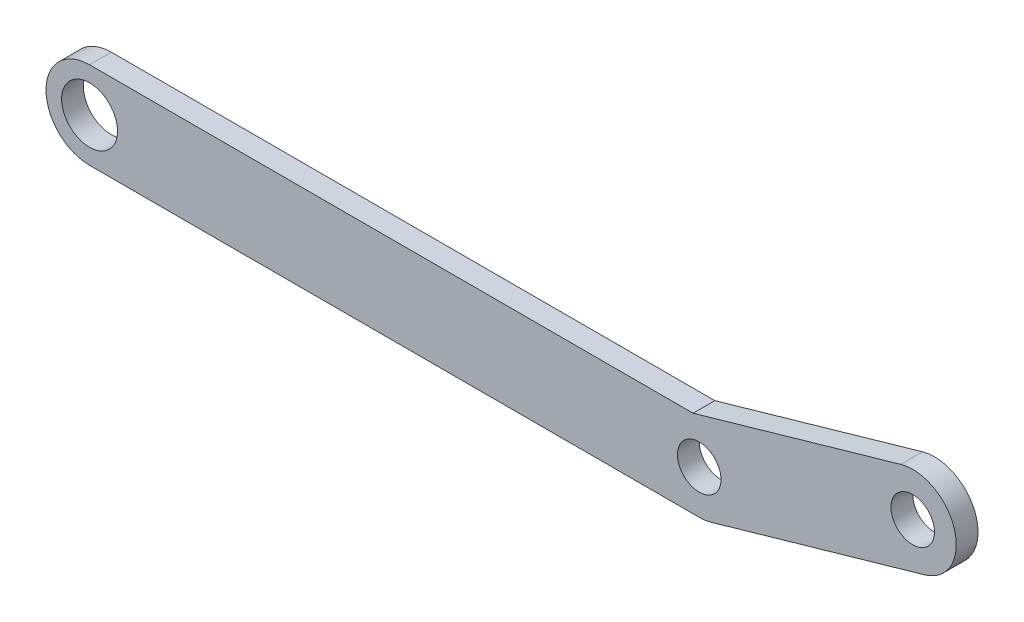
ISO-10303-21;
HEADER;
FILE_DESCRIPTION(('STEP AP214'),'2;1');
FILE_NAME('part.step','',(''),(''),'','','');
FILE_SCHEMA(('AUTOMOTIVE_DESIGN { 1 0 10303 214 1 1 1 1 }'));
ENDSEC;
DATA;
#1=APPLICATION_CONTEXT('core data for automotive mechanical design processes');
#2=APPLICATION_PROTOCOL_DEFINITION('international standard','automotive_design',2000,#1);
#3=PRODUCT_CONTEXT('',#1,'mechanical');
#4=PRODUCT('Part','Part','',(#3));
#5=PRODUCT_RELATED_PRODUCT_CATEGORY('part','',(#4));
#6=PRODUCT_DEFINITION_FORMATION('','',#4);
#7=PRODUCT_DEFINITION_CONTEXT('part definition',#1,'design');
#8=PRODUCT_DEFINITION('design','',#6,#7);
#9=PRODUCT_DEFINITION_SHAPE('','',#8);
#10=(LENGTH_UNIT() NAMED_UNIT(*) SI_UNIT(.MILLI.,.METRE.));
#11=(NAMED_UNIT(*) PLANE_ANGLE_UNIT() SI_UNIT($,.RADIAN.));
#12=(NAMED_UNIT(*) SI_UNIT($,.STERADIAN.) SOLID_ANGLE_UNIT());
#13=UNCERTAINTY_MEASURE_WITH_UNIT(LENGTH_MEASURE(1.E-05),#10,'distance_accuracy_value','');
#14=(GEOMETRIC_REPRESENTATION_CONTEXT(3) GLOBAL_UNCERTAINTY_ASSIGNED_CONTEXT((#13)) GLOBAL_UNIT_ASSIGNED_CONTEXT((#10,
#11,#12)) REPRESENTATION_CONTEXT('',''));
#15=CARTESIAN_POINT('',(0.,0.,0.));
#16=DIRECTION('',(0.,0.,1.));
#17=DIRECTION('',(1.,0.,0.));
#18=AXIS2_PLACEMENT_3D('',#15,#16,#17);
#19=CARTESIAN_POINT('',(-70.,0.,5.));
#20=DIRECTION('',(0.,0.,1.));
#21=DIRECTION('',(1.,0.,0.));
#22=AXIS2_PLACEMENT_3D('',#19,#20,#21);
#23=PLANE('',#22);
#24=CARTESIAN_POINT('',(70.,0.,5.));
#25=DIRECTION('',(0.,0.,1.));
#26=DIRECTION('',(1.,0.,0.));
#27=AXIS2_PLACEMENT_3D('',#24,#25,#26);
#28=CIRCLE('',#27,5.);
#29=CARTESIAN_POINT('',(75.,0.,5.));
#30=VERTEX_POINT('',#29);
#31=EDGE_CURVE('E196',#30,#30,#28,.T.);
#32=ORIENTED_EDGE('',*,*,#31,.F.);
#33=EDGE_LOOP('',(#32));
#34=FACE_BOUND('',#33,.T.);
#35=CARTESIAN_POINT('',(-70.,0.,5.));
#36=DIRECTION('',(0.,0.,1.));
#37=DIRECTION('',(1.,0.,0.));
#38=AXIS2_PLACEMENT_3D('',#35,#36,#37);
#39=CIRCLE('',#38,10.);
#40=CARTESIAN_POINT('',(-70.,10.,5.));
#41=VERTEX_POINT('',#40);
#42=CARTESIAN_POINT('',(-70.,-10.,5.));
#43=VERTEX_POINT('',#42);
#44=EDGE_CURVE('E161',#41,#43,#39,.T.);
#45=ORIENTED_EDGE('',*,*,#44,.T.);
#46=DIRECTION('',(1.,0.,0.));
#47=VECTOR('',#46,1.);
#48=CARTESIAN_POINT('',(-70.,-10.,5.));
#49=LINE('',#48,#47);
#50=CARTESIAN_POINT('',(69.9999999999996,-9.99999999999996,5.));
#51=VERTEX_POINT('',#50);
#52=EDGE_CURVE('E103',#43,#51,#49,.T.);
#53=ORIENTED_EDGE('',*,*,#52,.T.);
#54=CARTESIAN_POINT('',(69.9999999999999,2.8796409701215E-13,5.));
#55=DIRECTION('',(0.,0.,1.));
#56=DIRECTION('',(-1.,0.,0.));
#57=AXIS2_PLACEMENT_3D('',#54,#55,#56);
#58=CIRCLE('',#57,10.0000000000002);
#59=CARTESIAN_POINT('',(72.7563735581697,-9.61261695938318,5.));
#60=VERTEX_POINT('',#59);
#61=EDGE_CURVE('E179',#51,#60,#58,.T.);
#62=ORIENTED_EDGE('',*,*,#61,.T.);
#63=DIRECTION('',(0.961261695938319,0.275637355816998,0.));
#64=VECTOR('',#63,1.);
#65=CARTESIAN_POINT('',(72.7563735581697,-9.61261695938318,5.));
#66=LINE('',#65,#64);
#67=CARTESIAN_POINT('',(121.780720051024,4.44488818728381,5.));
#68=VERTEX_POINT('',#67);
#69=EDGE_CURVE('E118',#60,#68,#66,.T.);
#70=ORIENTED_EDGE('',*,*,#69,.T.);
#71=CARTESIAN_POINT('',(119.024346492854,14.057505146667,5.));
#72=DIRECTION('',(0.,0.,1.));
#73=DIRECTION('',(1.,0.,0.));
#74=AXIS2_PLACEMENT_3D('',#71,#72,#73);
#75=CIRCLE('',#74,10.);
#76=CARTESIAN_POINT('',(116.267972934684,23.6701221060502,5.));
#77=VERTEX_POINT('',#76);
#78=EDGE_CURVE('E114',#68,#77,#75,.T.);
#79=ORIENTED_EDGE('',*,*,#78,.T.);
#80=DIRECTION('',(-0.961261695938319,-0.275637355816998,0.));
#81=VECTOR('',#80,1.);
#82=CARTESIAN_POINT('',(68.5945916529754,9.99999999999994,5.));
#83=LINE('',#82,#81);
#84=CARTESIAN_POINT('',(68.5945916529754,9.99999999999994,5.));
#85=VERTEX_POINT('',#84);
#86=EDGE_CURVE('E116',#77,#85,#83,.T.);
#87=ORIENTED_EDGE('',*,*,#86,.T.);
#88=DIRECTION('',(-1.,0.,0.));
#89=VECTOR('',#88,1.);
#90=CARTESIAN_POINT('',(-70.,10.,5.));
#91=LINE('',#90,#89);
#92=EDGE_CURVE('E65',#85,#41,#91,.T.);
#93=ORIENTED_EDGE('',*,*,#92,.T.);
#94=EDGE_LOOP('',(#45,#53,#62,#70,#79,#87,#93));
#95=FACE_BOUND('',#94,.T.);
#96=CARTESIAN_POINT('',(-70.,0.,5.));
#97=DIRECTION('',(0.,0.,1.));
#98=DIRECTION('',(1.,0.,0.));
#99=AXIS2_PLACEMENT_3D('',#96,#97,#98);
#100=CIRCLE('',#99,6.41735157373834);
#101=CARTESIAN_POINT('',(-63.5826484262617,0.,5.));
#102=VERTEX_POINT('',#101);
#103=EDGE_CURVE('E148',#102,#102,#100,.T.);
#104=ORIENTED_EDGE('',*,*,#103,.F.);
#105=EDGE_LOOP('',(#104));
#106=FACE_BOUND('',#105,.T.);
#107=CARTESIAN_POINT('',(119.024346492854,14.057505146667,5.));
#108=DIRECTION('',(0.,0.,1.));
#109=DIRECTION('',(1.,0.,0.));
#110=AXIS2_PLACEMENT_3D('',#107,#108,#109);
#111=CIRCLE('',#110,5.);
#112=CARTESIAN_POINT('',(124.024346492854,14.057505146667,5.));
#113=VERTEX_POINT('',#112);
#114=EDGE_CURVE('E206',#113,#113,#111,.T.);
#115=ORIENTED_EDGE('',*,*,#114,.F.);
#116=EDGE_LOOP('',(#115));
#117=FACE_BOUND('',#116,.T.);
#118=ADVANCED_FACE('F44',(#34,#95,#106,#117),#23,.T.);
#119=CARTESIAN_POINT('',(-70.,0.,0.));
#120=DIRECTION('',(0.,0.,1.));
#121=DIRECTION('',(1.,0.,0.));
#122=AXIS2_PLACEMENT_3D('',#119,#120,#121);
#123=PLANE('',#122);
#124=CARTESIAN_POINT('',(-70.,0.,0.));
#125=DIRECTION('',(0.,0.,1.));
#126=DIRECTION('',(1.,0.,0.));
#127=AXIS2_PLACEMENT_3D('',#124,#125,#126);
#128=CIRCLE('',#127,10.);
#129=CARTESIAN_POINT('',(-70.,10.,0.));
#130=VERTEX_POINT('',#129);
#131=CARTESIAN_POINT('',(-70.,-10.,0.));
#132=VERTEX_POINT('',#131);
#133=EDGE_CURVE('E143',#130,#132,#128,.T.);
#134=ORIENTED_EDGE('',*,*,#133,.F.);
#135=DIRECTION('',(-1.,0.,0.));
#136=VECTOR('',#135,1.);
#137=CARTESIAN_POINT('',(-70.,10.,0.));
#138=LINE('',#137,#136);
#139=CARTESIAN_POINT('',(68.5945916529754,9.99999999999994,0.));
#140=VERTEX_POINT('',#139);
#141=EDGE_CURVE('E92',#140,#130,#138,.T.);
#142=ORIENTED_EDGE('',*,*,#141,.F.);
#143=DIRECTION('',(-0.961261695938319,-0.275637355816998,0.));
#144=VECTOR('',#143,1.);
#145=CARTESIAN_POINT('',(68.5945916529754,9.99999999999994,0.));
#146=LINE('',#145,#144);
#147=CARTESIAN_POINT('',(116.267972934684,23.6701221060502,0.));
#148=VERTEX_POINT('',#147);
#149=EDGE_CURVE('E90',#148,#140,#146,.T.);
#150=ORIENTED_EDGE('',*,*,#149,.F.);
#151=CARTESIAN_POINT('',(119.024346492854,14.057505146667,0.));
#152=DIRECTION('',(0.,0.,1.));
#153=DIRECTION('',(1.,0.,0.));
#154=AXIS2_PLACEMENT_3D('',#151,#152,#153);
#155=CIRCLE('',#154,10.);
#156=CARTESIAN_POINT('',(121.780720051024,4.44488818728381,0.));
#157=VERTEX_POINT('',#156);
#158=EDGE_CURVE('E126',#157,#148,#155,.T.);
#159=ORIENTED_EDGE('',*,*,#158,.F.);
#160=DIRECTION('',(0.961261695938319,0.275637355816998,0.));
#161=VECTOR('',#160,1.);
#162=CARTESIAN_POINT('',(72.7563735581697,-9.61261695938318,0.));
#163=LINE('',#162,#161);
#164=CARTESIAN_POINT('',(72.7563735581697,-9.61261695938318,0.));
#165=VERTEX_POINT('',#164);
#166=EDGE_CURVE('E155',#165,#157,#163,.T.);
#167=ORIENTED_EDGE('',*,*,#166,.F.);
#168=CARTESIAN_POINT('',(69.9999999999999,2.8796409701215E-13,0.));
#169=DIRECTION('',(0.,0.,1.));
#170=DIRECTION('',(-1.,0.,0.));
#171=AXIS2_PLACEMENT_3D('',#168,#169,#170);
#172=CIRCLE('',#171,10.0000000000002);
#173=CARTESIAN_POINT('',(69.9999999999996,-9.99999999999996,0.));
#174=VERTEX_POINT('',#173);
#175=EDGE_CURVE('E149',#174,#165,#172,.T.);
#176=ORIENTED_EDGE('',*,*,#175,.F.);
#177=DIRECTION('',(1.,0.,0.));
#178=VECTOR('',#177,1.);
#179=CARTESIAN_POINT('',(-70.,-10.,0.));
#180=LINE('',#179,#178);
#181=EDGE_CURVE('E144',#132,#174,#180,.T.);
#182=ORIENTED_EDGE('',*,*,#181,.F.);
#183=EDGE_LOOP('',(#134,#142,#150,#159,#167,#176,#182));
#184=FACE_BOUND('',#183,.T.);
#185=CARTESIAN_POINT('',(-70.,0.,0.));
#186=DIRECTION('',(0.,0.,1.));
#187=DIRECTION('',(1.,0.,0.));
#188=AXIS2_PLACEMENT_3D('',#185,#186,#187);
#189=CIRCLE('',#188,6.41735157373834);
#190=CARTESIAN_POINT('',(-63.5826484262617,0.,0.));
#191=VERTEX_POINT('',#190);
#192=EDGE_CURVE('E191',#191,#191,#189,.T.);
#193=ORIENTED_EDGE('',*,*,#192,.T.);
#194=EDGE_LOOP('',(#193));
#195=FACE_BOUND('',#194,.T.);
#196=CARTESIAN_POINT('',(70.,0.,0.));
#197=DIRECTION('',(0.,0.,1.));
#198=DIRECTION('',(1.,0.,0.));
#199=AXIS2_PLACEMENT_3D('',#196,#197,#198);
#200=CIRCLE('',#199,5.);
#201=CARTESIAN_POINT('',(75.,0.,0.));
#202=VERTEX_POINT('',#201);
#203=EDGE_CURVE('E205',#202,#202,#200,.T.);
#204=ORIENTED_EDGE('',*,*,#203,.T.);
#205=EDGE_LOOP('',(#204));
#206=FACE_BOUND('',#205,.T.);
#207=CARTESIAN_POINT('',(119.024346492854,14.057505146667,0.));
#208=DIRECTION('',(0.,0.,1.));
#209=DIRECTION('',(1.,0.,0.));
#210=AXIS2_PLACEMENT_3D('',#207,#208,#209);
#211=CIRCLE('',#210,5.);
#212=CARTESIAN_POINT('',(124.024346492854,14.057505146667,0.));
#213=VERTEX_POINT('',#212);
#214=EDGE_CURVE('E209',#213,#213,#211,.T.);
#215=ORIENTED_EDGE('',*,*,#214,.T.);
#216=EDGE_LOOP('',(#215));
#217=FACE_BOUND('',#216,.T.);
#218=ADVANCED_FACE('F185',(#184,#195,#206,#217),#123,.F.);
#219=CARTESIAN_POINT('',(-70.,0.,5.));
#220=DIRECTION('',(0.,0.,-1.));
#221=DIRECTION('',(-1.,0.,0.));
#222=AXIS2_PLACEMENT_3D('',#219,#220,#221);
#223=CYLINDRICAL_SURFACE('',#222,10.);
#224=ORIENTED_EDGE('',*,*,#133,.T.);
#225=DIRECTION('',(0.,0.,-1.));
#226=VECTOR('',#225,1.);
#227=CARTESIAN_POINT('',(-70.,-10.,5.));
#228=LINE('',#227,#226);
#229=EDGE_CURVE('E11',#43,#132,#228,.T.);
#230=ORIENTED_EDGE('',*,*,#229,.F.);
#231=ORIENTED_EDGE('',*,*,#44,.F.);
#232=DIRECTION('',(0.,0.,-1.));
#233=VECTOR('',#232,1.);
#234=CARTESIAN_POINT('',(-70.,10.,5.));
#235=LINE('',#234,#233);
#236=EDGE_CURVE('E140',#41,#130,#235,.T.);
#237=ORIENTED_EDGE('',*,*,#236,.T.);
#238=EDGE_LOOP('',(#224,#230,#231,#237));
#239=FACE_BOUND('',#238,.T.);
#240=ADVANCED_FACE('F50',(#239),#223,.T.);
#241=CARTESIAN_POINT('',(-70.,-10.,5.));
#242=DIRECTION('',(0.,1.,0.));
#243=DIRECTION('',(-1.,0.,0.));
#244=AXIS2_PLACEMENT_3D('',#241,#242,#243);
#245=PLANE('',#244);
#246=ORIENTED_EDGE('',*,*,#181,.T.);
#247=DIRECTION('',(0.,0.,-1.));
#248=VECTOR('',#247,1.);
#249=CARTESIAN_POINT('',(69.9999999999996,-9.99999999999996,5.));
#250=LINE('',#249,#248);
#251=EDGE_CURVE('E54',#51,#174,#250,.T.);
#252=ORIENTED_EDGE('',*,*,#251,.F.);
#253=ORIENTED_EDGE('',*,*,#52,.F.);
#254=ORIENTED_EDGE('',*,*,#229,.T.);
#255=EDGE_LOOP('',(#246,#252,#253,#254));
#256=FACE_BOUND('',#255,.T.);
#257=ADVANCED_FACE('F245',(#256),#245,.F.);
#258=CARTESIAN_POINT('',(69.9999999999999,2.8796409701215E-13,5.));
#259=DIRECTION('',(0.,0.,-1.));
#260=DIRECTION('',(-1.,0.,0.));
#261=AXIS2_PLACEMENT_3D('',#258,#259,#260);
#262=CYLINDRICAL_SURFACE('',#261,10.0000000000002);
#263=ORIENTED_EDGE('',*,*,#175,.T.);
#264=DIRECTION('',(0.,0.,-1.));
#265=VECTOR('',#264,1.);
#266=CARTESIAN_POINT('',(72.7563735581697,-9.61261695938318,5.));
#267=LINE('',#266,#265);
#268=EDGE_CURVE('E169',#60,#165,#267,.T.);
#269=ORIENTED_EDGE('',*,*,#268,.F.);
#270=ORIENTED_EDGE('',*,*,#61,.F.);
#271=ORIENTED_EDGE('',*,*,#251,.T.);
#272=EDGE_LOOP('',(#263,#269,#270,#271));
#273=FACE_BOUND('',#272,.T.);
#274=ADVANCED_FACE('F177',(#273),#262,.T.);
#275=CARTESIAN_POINT('',(72.7563735581697,-9.61261695938318,5.));
#276=DIRECTION('',(-0.275637355816998,0.961261695938319,0.));
#277=DIRECTION('',(-0.961261695938319,-0.275637355816998,0.));
#278=AXIS2_PLACEMENT_3D('',#275,#276,#277);
#279=PLANE('',#278);
#280=ORIENTED_EDGE('',*,*,#166,.T.);
#281=DIRECTION('',(0.,0.,-1.));
#282=VECTOR('',#281,1.);
#283=CARTESIAN_POINT('',(121.780720051024,4.44488818728381,5.));
#284=LINE('',#283,#282);
#285=EDGE_CURVE('E128',#68,#157,#284,.T.);
#286=ORIENTED_EDGE('',*,*,#285,.F.);
#287=ORIENTED_EDGE('',*,*,#69,.F.);
#288=ORIENTED_EDGE('',*,*,#268,.T.);
#289=EDGE_LOOP('',(#280,#286,#287,#288));
#290=FACE_BOUND('',#289,.T.);
#291=ADVANCED_FACE('F183',(#290),#279,.F.);
#292=CARTESIAN_POINT('',(119.024346492854,14.057505146667,5.));
#293=DIRECTION('',(0.,0.,-1.));
#294=DIRECTION('',(-1.,0.,0.));
#295=AXIS2_PLACEMENT_3D('',#292,#293,#294);
#296=CYLINDRICAL_SURFACE('',#295,10.);
#297=ORIENTED_EDGE('',*,*,#158,.T.);
#298=DIRECTION('',(0.,0.,-1.));
#299=VECTOR('',#298,1.);
#300=CARTESIAN_POINT('',(116.267972934684,23.6701221060502,5.));
#301=LINE('',#300,#299);
#302=EDGE_CURVE('E123',#77,#148,#301,.T.);
#303=ORIENTED_EDGE('',*,*,#302,.F.);
#304=ORIENTED_EDGE('',*,*,#78,.F.);
#305=ORIENTED_EDGE('',*,*,#285,.T.);
#306=EDGE_LOOP('',(#297,#303,#304,#305));
#307=FACE_BOUND('',#306,.T.);
#308=ADVANCED_FACE('F127',(#307),#296,.T.);
#309=CARTESIAN_POINT('',(68.5945916529754,9.99999999999994,5.));
#310=DIRECTION('',(0.275637355816998,-0.961261695938319,0.));
#311=DIRECTION('',(0.961261695938319,0.275637355816998,0.));
#312=AXIS2_PLACEMENT_3D('',#309,#310,#311);
#313=PLANE('',#312);
#314=ORIENTED_EDGE('',*,*,#149,.T.);
#315=DIRECTION('',(0.,0.,-1.));
#316=VECTOR('',#315,1.);
#317=CARTESIAN_POINT('',(68.5945916529754,9.99999999999994,5.));
#318=LINE('',#317,#316);
#319=EDGE_CURVE('E134',#85,#140,#318,.T.);
#320=ORIENTED_EDGE('',*,*,#319,.F.);
#321=ORIENTED_EDGE('',*,*,#86,.F.);
#322=ORIENTED_EDGE('',*,*,#302,.T.);
#323=EDGE_LOOP('',(#314,#320,#321,#322));
#324=FACE_BOUND('',#323,.T.);
#325=ADVANCED_FACE('F135',(#324),#313,.F.);
#326=CARTESIAN_POINT('',(-70.,10.,5.));
#327=DIRECTION('',(0.,-1.,0.));
#328=DIRECTION('',(1.,0.,0.));
#329=AXIS2_PLACEMENT_3D('',#326,#327,#328);
#330=PLANE('',#329);
#331=ORIENTED_EDGE('',*,*,#141,.T.);
#332=ORIENTED_EDGE('',*,*,#236,.F.);
#333=ORIENTED_EDGE('',*,*,#92,.F.);
#334=ORIENTED_EDGE('',*,*,#319,.T.);
#335=EDGE_LOOP('',(#331,#332,#333,#334));
#336=FACE_BOUND('',#335,.T.);
#337=ADVANCED_FACE('F234',(#336),#330,.F.);
#338=CARTESIAN_POINT('',(-70.,0.,5.));
#339=DIRECTION('',(0.,0.,-1.));
#340=DIRECTION('',(-1.,0.,0.));
#341=AXIS2_PLACEMENT_3D('',#338,#339,#340);
#342=CYLINDRICAL_SURFACE('',#341,6.41735157373834);
#343=ORIENTED_EDGE('',*,*,#103,.T.);
#344=EDGE_LOOP('',(#343));
#345=FACE_BOUND('',#344,.T.);
#346=ORIENTED_EDGE('',*,*,#192,.F.);
#347=EDGE_LOOP('',(#346));
#348=FACE_BOUND('',#347,.T.);
#349=ADVANCED_FACE('F227',(#345,#348),#342,.F.);
#350=CARTESIAN_POINT('',(70.,0.,5.));
#351=DIRECTION('',(0.,0.,-1.));
#352=DIRECTION('',(-1.,0.,0.));
#353=AXIS2_PLACEMENT_3D('',#350,#351,#352);
#354=CYLINDRICAL_SURFACE('',#353,5.);
#355=ORIENTED_EDGE('',*,*,#31,.T.);
#356=EDGE_LOOP('',(#355));
#357=FACE_BOUND('',#356,.T.);
#358=ORIENTED_EDGE('',*,*,#203,.F.);
#359=EDGE_LOOP('',(#358));
#360=FACE_BOUND('',#359,.T.);
#361=ADVANCED_FACE('F302',(#357,#360),#354,.F.);
#362=CARTESIAN_POINT('',(119.024346492854,14.057505146667,5.));
#363=DIRECTION('',(0.,0.,-1.));
#364=DIRECTION('',(-1.,0.,0.));
#365=AXIS2_PLACEMENT_3D('',#362,#363,#364);
#366=CYLINDRICAL_SURFACE('',#365,5.);
#367=ORIENTED_EDGE('',*,*,#114,.T.);
#368=EDGE_LOOP('',(#367));
#369=FACE_BOUND('',#368,.T.);
#370=ORIENTED_EDGE('',*,*,#214,.F.);
#371=EDGE_LOOP('',(#370));
#372=FACE_BOUND('',#371,.T.);
#373=ADVANCED_FACE('F217',(#369,#372),#366,.F.);
#374=CLOSED_SHELL('',(#118,#218,#240,#257,#274,#291,#308,#325,#337,#349,#361,#373));
#375=MANIFOLD_SOLID_BREP('B2',#374);
#376=ADVANCED_BREP_SHAPE_REPRESENTATION('',(#18,#375),#14);
#377=SHAPE_DEFINITION_REPRESENTATION(#9,#376);
ENDSEC;
END-ISO-10303-21;
